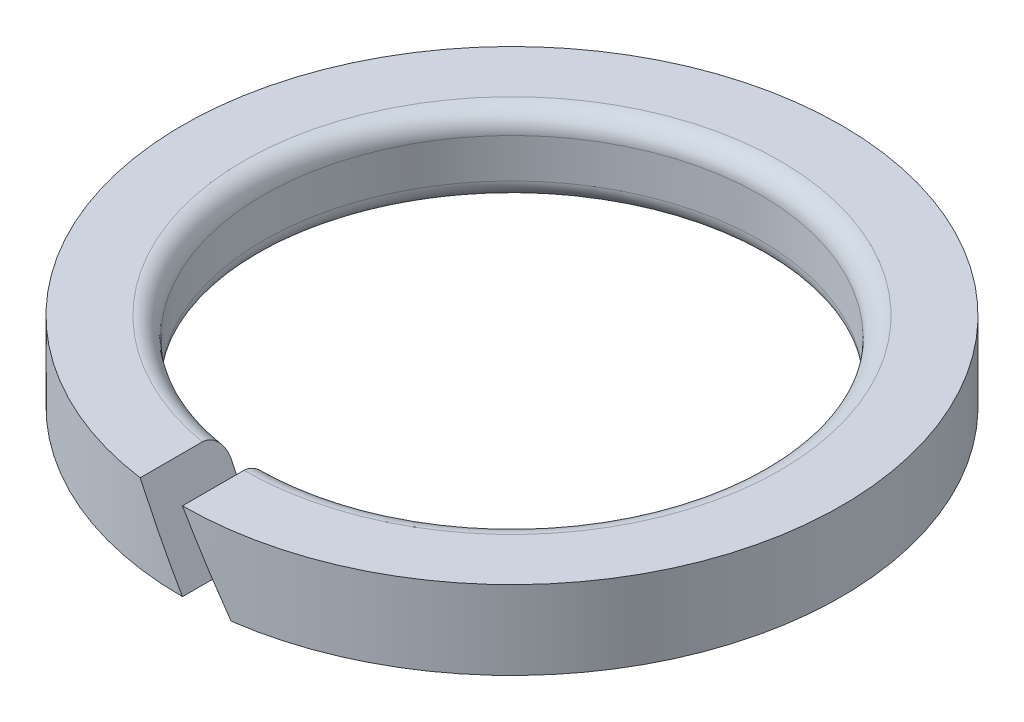
ISO-10303-21;
HEADER;
FILE_DESCRIPTION(('STEP AP214'),'2;1');
FILE_NAME('part.step','',(''),(''),'','','');
FILE_SCHEMA(('AUTOMOTIVE_DESIGN { 1 0 10303 214 1 1 1 1 }'));
ENDSEC;
DATA;
#1=APPLICATION_CONTEXT('core data for automotive mechanical design processes');
#2=APPLICATION_PROTOCOL_DEFINITION('international standard','automotive_design',2000,#1);
#3=PRODUCT_CONTEXT('',#1,'mechanical');
#4=PRODUCT('Part','Part','',(#3));
#5=PRODUCT_RELATED_PRODUCT_CATEGORY('part','',(#4));
#6=PRODUCT_DEFINITION_FORMATION('','',#4);
#7=PRODUCT_DEFINITION_CONTEXT('part definition',#1,'design');
#8=PRODUCT_DEFINITION('design','',#6,#7);
#9=PRODUCT_DEFINITION_SHAPE('','',#8);
#10=(LENGTH_UNIT() NAMED_UNIT(*) SI_UNIT(.MILLI.,.METRE.));
#11=(NAMED_UNIT(*) PLANE_ANGLE_UNIT() SI_UNIT($,.RADIAN.));
#12=(NAMED_UNIT(*) SI_UNIT($,.STERADIAN.) SOLID_ANGLE_UNIT());
#13=UNCERTAINTY_MEASURE_WITH_UNIT(LENGTH_MEASURE(1.E-05),#10,'distance_accuracy_value','');
#14=(GEOMETRIC_REPRESENTATION_CONTEXT(3) GLOBAL_UNCERTAINTY_ASSIGNED_CONTEXT((#13)) GLOBAL_UNIT_ASSIGNED_CONTEXT((#10,
#11,#12)) REPRESENTATION_CONTEXT('',''));
#15=CARTESIAN_POINT('',(0.,0.,0.));
#16=DIRECTION('',(0.,0.,1.));
#17=DIRECTION('',(1.,0.,0.));
#18=AXIS2_PLACEMENT_3D('',#15,#16,#17);
#19=CARTESIAN_POINT('',(0.,8.,0.));
#20=DIRECTION('',(0.,1.,0.));
#21=DIRECTION('',(0.,0.,1.));
#22=AXIS2_PLACEMENT_3D('',#19,#20,#21);
#23=PLANE('',#22);
#24=DIRECTION('',(0.,0.,-1.));
#25=VECTOR('',#24,1.);
#26=CARTESIAN_POINT('',(-4.61880215351698,8.,33.5));
#27=LINE('',#26,#25);
#28=CARTESIAN_POINT('',(-4.61880215351698,8.,33.1800642956982));
#29=VERTEX_POINT('',#28);
#30=CARTESIAN_POINT('',(-4.61880215351698,8.,26.855710131491));
#31=VERTEX_POINT('',#30);
#32=EDGE_CURVE('E101',#29,#31,#27,.T.);
#33=ORIENTED_EDGE('',*,*,#32,.T.);
#34=CARTESIAN_POINT('',(0.,8.,0.));
#35=DIRECTION('',(0.,1.,0.));
#36=DIRECTION('',(0.,0.,1.));
#37=AXIS2_PLACEMENT_3D('',#34,#35,#36);
#38=CIRCLE('',#37,27.25);
#39=CARTESIAN_POINT('',(0.,8.,27.25));
#40=VERTEX_POINT('',#39);
#41=EDGE_CURVE('E11',#31,#40,#38,.F.);
#42=ORIENTED_EDGE('',*,*,#41,.T.);
#43=DIRECTION('',(0.,0.,-1.));
#44=VECTOR('',#43,1.);
#45=CARTESIAN_POINT('',(0.,8.,33.5));
#46=LINE('',#45,#44);
#47=CARTESIAN_POINT('',(0.,8.,33.5));
#48=VERTEX_POINT('',#47);
#49=EDGE_CURVE('E89',#48,#40,#46,.T.);
#50=ORIENTED_EDGE('',*,*,#49,.F.);
#51=CARTESIAN_POINT('',(0.,8.,0.));
#52=DIRECTION('',(0.,1.,0.));
#53=DIRECTION('',(0.,0.,1.));
#54=AXIS2_PLACEMENT_3D('',#51,#52,#53);
#55=CIRCLE('',#54,33.5);
#56=EDGE_CURVE('E100',#48,#29,#55,.T.);
#57=ORIENTED_EDGE('',*,*,#56,.T.);
#58=EDGE_LOOP('',(#33,#42,#50,#57));
#59=FACE_BOUND('',#58,.T.);
#60=ADVANCED_FACE('F34',(#59),#23,.T.);
#61=CARTESIAN_POINT('',(0.,0.,0.));
#62=DIRECTION('',(0.,1.,0.));
#63=DIRECTION('',(0.,0.,1.));
#64=AXIS2_PLACEMENT_3D('',#61,#62,#63);
#65=PLANE('',#64);
#66=DIRECTION('',(0.,0.,-1.));
#67=VECTOR('',#66,1.);
#68=CARTESIAN_POINT('',(4.61880215351698,0.,33.5));
#69=LINE('',#68,#67);
#70=CARTESIAN_POINT('',(4.61880215351698,0.,33.1800642956982));
#71=VERTEX_POINT('',#70);
#72=CARTESIAN_POINT('',(4.61880215351698,0.,26.855710131491));
#73=VERTEX_POINT('',#72);
#74=EDGE_CURVE('E91',#71,#73,#69,.T.);
#75=ORIENTED_EDGE('',*,*,#74,.T.);
#76=CARTESIAN_POINT('',(0.,0.,0.));
#77=DIRECTION('',(0.,1.,0.));
#78=DIRECTION('',(0.,0.,1.));
#79=AXIS2_PLACEMENT_3D('',#76,#77,#78);
#80=CIRCLE('',#79,27.25);
#81=CARTESIAN_POINT('',(0.,0.,27.25));
#82=VERTEX_POINT('',#81);
#83=EDGE_CURVE('E114',#73,#82,#80,.T.);
#84=ORIENTED_EDGE('',*,*,#83,.T.);
#85=DIRECTION('',(0.,0.,-1.));
#86=VECTOR('',#85,1.);
#87=CARTESIAN_POINT('',(0.,0.,33.5));
#88=LINE('',#87,#86);
#89=CARTESIAN_POINT('',(0.,0.,33.5));
#90=VERTEX_POINT('',#89);
#91=EDGE_CURVE('E220',#90,#82,#88,.T.);
#92=ORIENTED_EDGE('',*,*,#91,.F.);
#93=CARTESIAN_POINT('',(0.,0.,0.));
#94=DIRECTION('',(0.,1.,0.));
#95=DIRECTION('',(0.,0.,1.));
#96=AXIS2_PLACEMENT_3D('',#93,#94,#95);
#97=CIRCLE('',#96,33.5);
#98=EDGE_CURVE('E96',#71,#90,#97,.T.);
#99=ORIENTED_EDGE('',*,*,#98,.F.);
#100=EDGE_LOOP('',(#75,#84,#92,#99));
#101=FACE_BOUND('',#100,.T.);
#102=ADVANCED_FACE('F156',(#101),#65,.F.);
#103=CARTESIAN_POINT('',(0.,8.,0.));
#104=DIRECTION('',(0.,-1.,0.));
#105=DIRECTION('',(0.,0.,-1.));
#106=AXIS2_PLACEMENT_3D('',#103,#104,#105);
#107=CYLINDRICAL_SURFACE('',#106,33.5);
#108=CARTESIAN_POINT('',(0.,8.,0.));
#109=DIRECTION('',(-0.86602540378444,-0.499999999999998,0.));
#110=DIRECTION('',(0.499999999999998,-0.86602540378444,0.));
#111=AXIS2_PLACEMENT_3D('',#108,#109,#110);
#112=ELLIPSE('',#111,67.0000000000003,33.5);
#113=EDGE_CURVE('E87',#71,#48,#112,.T.);
#114=ORIENTED_EDGE('',*,*,#113,.F.);
#115=ORIENTED_EDGE('',*,*,#98,.T.);
#116=CARTESIAN_POINT('',(0.,0.,0.));
#117=DIRECTION('',(0.86602540378444,0.499999999999998,0.));
#118=DIRECTION('',(0.499999999999998,-0.86602540378444,0.));
#119=AXIS2_PLACEMENT_3D('',#116,#117,#118);
#120=ELLIPSE('',#119,67.0000000000003,33.5);
#121=EDGE_CURVE('E97',#29,#90,#120,.T.);
#122=ORIENTED_EDGE('',*,*,#121,.F.);
#123=ORIENTED_EDGE('',*,*,#56,.F.);
#124=EDGE_LOOP('',(#114,#115,#122,#123));
#125=FACE_BOUND('',#124,.T.);
#126=ADVANCED_FACE('F104',(#125),#107,.T.);
#127=CARTESIAN_POINT('',(0.,8.,0.));
#128=DIRECTION('',(0.,-1.,0.));
#129=DIRECTION('',(0.,0.,-1.));
#130=AXIS2_PLACEMENT_3D('',#127,#128,#129);
#131=CYLINDRICAL_SURFACE('',#130,25.25);
#132=CARTESIAN_POINT('',(0.,0.,0.));
#133=DIRECTION('',(0.86602540378444,0.499999999999998,0.));
#134=DIRECTION('',(0.499999999999998,-0.86602540378444,0.));
#135=AXIS2_PLACEMENT_3D('',#132,#133,#134);
#136=ELLIPSE('',#135,50.5000000000002,25.25);
#137=CARTESIAN_POINT('',(-3.46410161513775,6.00000000000002,25.0112474698884));
#138=VERTEX_POINT('',#137);
#139=CARTESIAN_POINT('',(-1.15470053837925,2.00000000000001,25.2235835413342));
#140=VERTEX_POINT('',#139);
#141=EDGE_CURVE('E105',#138,#140,#136,.T.);
#142=ORIENTED_EDGE('',*,*,#141,.T.);
#143=CARTESIAN_POINT('',(0.,2.,0.));
#144=DIRECTION('',(0.,1.,0.));
#145=DIRECTION('',(0.,0.,1.));
#146=AXIS2_PLACEMENT_3D('',#143,#144,#145);
#147=CIRCLE('',#146,25.25);
#148=CARTESIAN_POINT('',(3.46410161513774,2.,25.0112474698884));
#149=VERTEX_POINT('',#148);
#150=EDGE_CURVE('E215',#140,#149,#147,.F.);
#151=ORIENTED_EDGE('',*,*,#150,.T.);
#152=CARTESIAN_POINT('',(0.,8.,0.));
#153=DIRECTION('',(-0.86602540378444,-0.499999999999998,0.));
#154=DIRECTION('',(0.499999999999998,-0.86602540378444,0.));
#155=AXIS2_PLACEMENT_3D('',#152,#153,#154);
#156=ELLIPSE('',#155,50.5000000000002,25.25);
#157=CARTESIAN_POINT('',(1.15470053837924,6.,25.2235835413342));
#158=VERTEX_POINT('',#157);
#159=EDGE_CURVE('E108',#149,#158,#156,.T.);
#160=ORIENTED_EDGE('',*,*,#159,.T.);
#161=CARTESIAN_POINT('',(0.,6.,0.));
#162=DIRECTION('',(0.,1.,0.));
#163=DIRECTION('',(0.,0.,1.));
#164=AXIS2_PLACEMENT_3D('',#161,#162,#163);
#165=CIRCLE('',#164,25.25);
#166=EDGE_CURVE('E214',#158,#138,#165,.T.);
#167=ORIENTED_EDGE('',*,*,#166,.T.);
#168=EDGE_LOOP('',(#142,#151,#160,#167));
#169=FACE_BOUND('',#168,.T.);
#170=ADVANCED_FACE('F132',(#169),#131,.F.);
#171=CARTESIAN_POINT('',(0.,0.,33.5));
#172=DIRECTION('',(0.86602540378444,0.499999999999998,0.));
#173=DIRECTION('',(-0.499999999999998,0.86602540378444,0.));
#174=AXIS2_PLACEMENT_3D('',#171,#172,#173);
#175=PLANE('',#174);
#176=ORIENTED_EDGE('',*,*,#91,.T.);
#177=CARTESIAN_POINT('',(0.,0.,27.25));
#178=CARTESIAN_POINT('',(5.10975107489599E-06,-8.85034847575498E-06,27.1990278515768));
#179=CARTESIAN_POINT('',(-0.0011248915475984,0.00194836931344521,27.1480607499647));
#180=CARTESIAN_POINT('',(-0.00561609105124405,0.00972735504068765,27.0465383086451));
#181=CARTESIAN_POINT('',(-0.00897652359712368,0.0155477949455592,26.9959828336614));
#182=CARTESIAN_POINT('',(-0.0178697271162579,0.0309512752827502,26.8958736236166));
#183=CARTESIAN_POINT('',(-0.0233927394789516,0.0405174133057667,26.8463164256403));
#184=CARTESIAN_POINT('',(-0.0365335692625409,0.0632779981445579,26.7483380784702));
#185=CARTESIAN_POINT('',(-0.0441514801956002,0.076472606928151,26.6999169800943));
#186=CARTESIAN_POINT('',(-0.0699989756506826,0.12124178230476,26.5569489292629));
#187=CARTESIAN_POINT('',(-0.0912393205477315,0.158031138836735,26.4645103144444));
#188=CARTESIAN_POINT('',(-0.140780337139241,0.243838696631842,26.2875643864683));
#189=CARTESIAN_POINT('',(-0.169087281258799,0.29286776205393,26.2030642117981));
#190=CARTESIAN_POINT('',(-0.233398147142047,0.404257449242464,26.0390508481762));
#191=CARTESIAN_POINT('',(-0.269740570043424,0.467204372177804,25.9600700417508));
#192=CARTESIAN_POINT('',(-0.347790715244217,0.602391189203707,25.8136143967677));
#193=CARTESIAN_POINT('',(-0.389499843813009,0.674633519024277,25.746142584795));
#194=CARTESIAN_POINT('',(-0.483302733642174,0.837104890105178,25.614551340226));
#195=CARTESIAN_POINT('',(-0.536031596844248,0.928433960196519,25.5522445692154));
#196=CARTESIAN_POINT('',(-0.645480509534529,1.11800503780926,25.4435688374276));
#197=CARTESIAN_POINT('',(-0.702205015874863,1.21625476482498,25.3972180246604));
#198=CARTESIAN_POINT('',(-0.823899864766214,1.42703642612422,25.3169212451128));
#199=CARTESIAN_POINT('',(-0.889138053118776,1.5400322829446,25.2846011611113));
#200=CARTESIAN_POINT('',(-1.02112812972964,1.76864580172952,25.239492732433));
#201=CARTESIAN_POINT('',(-1.08787610811094,1.88425669158845,25.2266587475356));
#202=CARTESIAN_POINT('',(-1.15470053837925,2.,25.2235835413342));
#203=B_SPLINE_CURVE_WITH_KNOTS('',3,(#177,#178,#179,#180,#181,#182,#183,#184,#185,#186,#187,
#188,#189,#190,#191,#192,#193,#194,#195,#196,#197,#198,#199,#200,#201,#202),.UNSPECIFIED.,.F.,
.F.,(4,2,2,2,2,2,2,2,2,2,2,2,4),(0.,0.152857924182382,0.305663402645712,0.45778715103197,
0.609917691026567,0.913616132487173,1.21758510595596,1.53832521378747,1.85914953884514,
2.22518957542007,2.59164457412787,2.99341414680034,3.39424123769922),.UNSPECIFIED.);
#204=EDGE_CURVE('E123',#82,#140,#203,.T.);
#205=ORIENTED_EDGE('',*,*,#204,.T.);
#206=ORIENTED_EDGE('',*,*,#141,.F.);
#207=CARTESIAN_POINT('',(-3.46410161513774,6.,25.0112474698884));
#208=CARTESIAN_POINT('',(-3.53490844278672,6.12264102301081,25.0014393766555));
#209=CARTESIAN_POINT('',(-3.60623476906791,6.24618184404706,25.0026556912724));
#210=CARTESIAN_POINT('',(-3.74850254477895,6.49259685985841,25.0284645204244));
#211=CARTESIAN_POINT('',(-3.81943347418945,6.61545283342548,25.0532846664184));
#212=CARTESIAN_POINT('',(-3.95833914013497,6.85604450430231,25.1280387586674));
#213=CARTESIAN_POINT('',(-4.02629895575517,6.97375435782951,25.1780864712413));
#214=CARTESIAN_POINT('',(-4.15571825710508,7.19791516324761,25.3040062488735));
#215=CARTESIAN_POINT('',(-4.21720661785712,7.30441612814428,25.3797566199833));
#216=CARTESIAN_POINT('',(-4.31413455712676,7.47230024363224,25.5308987347501));
#217=CARTESIAN_POINT('',(-4.35198422110399,7.53785778469022,25.6001484207776));
#218=CARTESIAN_POINT('',(-4.42139352362151,7.65807822316847,25.7503553903848));
#219=CARTESIAN_POINT('',(-4.45295478562935,7.71274393251706,25.831309642876));
#220=CARTESIAN_POINT('',(-4.5086093604611,7.80914048379929,26.0033233219123));
#221=CARTESIAN_POINT('',(-4.532676932734,7.85082674179078,26.0944161511588));
#222=CARTESIAN_POINT('',(-4.5722383101104,7.91934905742411,26.2837898350116));
#223=CARTESIAN_POINT('',(-4.58773499039055,7.94619009501799,26.3820682666072));
#224=CARTESIAN_POINT('',(-4.60543712481747,7.97685109124783,26.5435823161272));
#225=CARTESIAN_POINT('',(-4.61046595927021,7.98556128802282,26.6056413927392));
#226=CARTESIAN_POINT('',(-4.61714861938157,7.99713599486542,26.7303652472421));
#227=CARTESIAN_POINT('',(-4.61880882402983,8.00001155366716,26.7930286541211));
#228=CARTESIAN_POINT('',(-4.61880215351698,8.,26.855710131491));
#229=B_SPLINE_CURVE_WITH_KNOTS('',3,(#207,#208,#209,#210,#211,#212,#213,#214,#215,#216,#217,
#218,#219,#220,#221,#222,#223,#224,#225,#226,#227,#228),.UNSPECIFIED.,.F.,.F.,(4,2,2,2,2,2,2,2,
2,2,4),(0.,0.425865616400393,0.855880306606806,1.28785177732677,1.71780589631261,
2.02430834313816,2.3307315578501,2.63819600026513,2.94555723853329,3.13382712801995,
3.32174016715302),.UNSPECIFIED.);
#230=EDGE_CURVE('E117',#138,#31,#229,.T.);
#231=ORIENTED_EDGE('',*,*,#230,.T.);
#232=ORIENTED_EDGE('',*,*,#32,.F.);
#233=ORIENTED_EDGE('',*,*,#121,.T.);
#234=EDGE_LOOP('',(#176,#205,#206,#231,#232,#233));
#235=FACE_BOUND('',#234,.T.);
#236=ADVANCED_FACE('F128',(#235),#175,.T.);
#237=CARTESIAN_POINT('',(0.,8.,33.5));
#238=DIRECTION('',(-0.86602540378444,-0.499999999999998,0.));
#239=DIRECTION('',(0.499999999999998,-0.86602540378444,0.));
#240=AXIS2_PLACEMENT_3D('',#237,#238,#239);
#241=PLANE('',#240);
#242=ORIENTED_EDGE('',*,*,#159,.F.);
#243=CARTESIAN_POINT('',(3.46410161513774,2.,25.0112474698884));
#244=CARTESIAN_POINT('',(3.53490844278672,1.87735897698919,25.0014393766555));
#245=CARTESIAN_POINT('',(3.60623476906791,1.75381815595294,25.0026556912724));
#246=CARTESIAN_POINT('',(3.74850254477895,1.50740314014159,25.0284645204244));
#247=CARTESIAN_POINT('',(3.81943347418945,1.38454716657453,25.0532846664184));
#248=CARTESIAN_POINT('',(3.95833914013497,1.14395549569769,25.1280387586674));
#249=CARTESIAN_POINT('',(4.02629895575517,1.02624564217049,25.1780864712413));
#250=CARTESIAN_POINT('',(4.15571825710508,0.802084836752388,25.3040062488735));
#251=CARTESIAN_POINT('',(4.21720661785712,0.695583871855722,25.3797566199833));
#252=CARTESIAN_POINT('',(4.31413455712676,0.527699756367756,25.5308987347501));
#253=CARTESIAN_POINT('',(4.35198422110399,0.462142215309785,25.6001484207776));
#254=CARTESIAN_POINT('',(4.4213935236215,0.34192177683153,25.7503553903848));
#255=CARTESIAN_POINT('',(4.45295478562935,0.287256067482944,25.831309642876));
#256=CARTESIAN_POINT('',(4.5086093604611,0.190859516200705,26.0033233219123));
#257=CARTESIAN_POINT('',(4.532676932734,0.14917325820922,26.0944161511588));
#258=CARTESIAN_POINT('',(4.5722383101104,0.0806509425758891,26.2837898350116));
#259=CARTESIAN_POINT('',(4.58773499039055,0.0538099049820131,26.3820682666072));
#260=CARTESIAN_POINT('',(4.60543712481747,0.0231489087521738,26.5435823161272));
#261=CARTESIAN_POINT('',(4.61046595927021,0.0144387119771773,26.6056413927392));
#262=CARTESIAN_POINT('',(4.61714861938157,0.00286400513458443,26.7303652472421));
#263=CARTESIAN_POINT('',(4.61880882402983,-1.15536671598054E-05,26.7930286541211));
#264=CARTESIAN_POINT('',(4.61880215351698,0.,26.855710131491));
#265=B_SPLINE_CURVE_WITH_KNOTS('',3,(#243,#244,#245,#246,#247,#248,#249,#250,#251,#252,#253,
#254,#255,#256,#257,#258,#259,#260,#261,#262,#263,#264),.UNSPECIFIED.,.F.,.F.,(4,2,2,2,2,2,2,2,
2,2,4),(0.,0.425865616400393,0.855880306606807,1.28785177732677,1.71780589631261,
2.02430834313816,2.3307315578501,2.63819600026514,2.9455572385333,3.13382712801995,
3.32174016715302),.UNSPECIFIED.);
#266=EDGE_CURVE('E43',#149,#73,#265,.T.);
#267=ORIENTED_EDGE('',*,*,#266,.T.);
#268=ORIENTED_EDGE('',*,*,#74,.F.);
#269=ORIENTED_EDGE('',*,*,#113,.T.);
#270=ORIENTED_EDGE('',*,*,#49,.T.);
#271=CARTESIAN_POINT('',(0.,8.,27.25));
#272=CARTESIAN_POINT('',(-5.10975107498438E-06,8.00000885034848,27.1990278515768));
#273=CARTESIAN_POINT('',(0.00112489154759835,7.99805163068655,27.1480607499647));
#274=CARTESIAN_POINT('',(0.00561609105124407,7.99027264495931,27.0465383086451));
#275=CARTESIAN_POINT('',(0.00897652359712368,7.98445220505444,26.9959828336614));
#276=CARTESIAN_POINT('',(0.0178697271162577,7.96904872471725,26.8958736236166));
#277=CARTESIAN_POINT('',(0.0233927394789512,7.95948258669423,26.8463164256403));
#278=CARTESIAN_POINT('',(0.0365335692625405,7.93672200185544,26.7483380784702));
#279=CARTESIAN_POINT('',(0.0441514801956,7.92352739307185,26.6999169800943));
#280=CARTESIAN_POINT('',(0.0699989756506827,7.87875821769524,26.5569489292629));
#281=CARTESIAN_POINT('',(0.0912393205477316,7.84196886116327,26.4645103144444));
#282=CARTESIAN_POINT('',(0.14078033713924,7.75616130336816,26.2875643864683));
#283=CARTESIAN_POINT('',(0.169087281258799,7.70713223794607,26.2030642117981));
#284=CARTESIAN_POINT('',(0.233398147142047,7.59574255075754,26.0390508481762));
#285=CARTESIAN_POINT('',(0.269740570043424,7.5327956278222,25.9600700417508));
#286=CARTESIAN_POINT('',(0.347790715244217,7.39760881079629,25.8136143967677));
#287=CARTESIAN_POINT('',(0.389499843813008,7.32536648097572,25.746142584795));
#288=CARTESIAN_POINT('',(0.483302733642174,7.16289510989482,25.614551340226));
#289=CARTESIAN_POINT('',(0.536031596844248,7.07156603980348,25.5522445692154));
#290=CARTESIAN_POINT('',(0.645480509534529,6.88199496219074,25.4435688374276));
#291=CARTESIAN_POINT('',(0.702205015874863,6.78374523517502,25.3972180246604));
#292=CARTESIAN_POINT('',(0.823899864766214,6.57296357387578,25.3169212451128));
#293=CARTESIAN_POINT('',(0.889138053118776,6.4599677170554,25.2846011611113));
#294=CARTESIAN_POINT('',(1.02112812972964,6.23135419827048,25.239492732433));
#295=CARTESIAN_POINT('',(1.08787610811094,6.11574330841155,25.2266587475356));
#296=CARTESIAN_POINT('',(1.15470053837925,6.,25.2235835413342));
#297=B_SPLINE_CURVE_WITH_KNOTS('',3,(#271,#272,#273,#274,#275,#276,#277,#278,#279,#280,#281,
#282,#283,#284,#285,#286,#287,#288,#289,#290,#291,#292,#293,#294,#295,#296),.UNSPECIFIED.,.F.,
.F.,(4,2,2,2,2,2,2,2,2,2,2,2,4),(0.,0.152857924182382,0.305663402645709,0.457787151031966,
0.609917691026567,0.913616132487173,1.21758510595596,1.53832521378747,1.85914953884514,
2.22518957542007,2.59164457412787,2.99341414680034,3.39424123769922),.UNSPECIFIED.);
#298=EDGE_CURVE('E55',#40,#158,#297,.T.);
#299=ORIENTED_EDGE('',*,*,#298,.T.);
#300=EDGE_LOOP('',(#242,#267,#268,#269,#270,#299));
#301=FACE_BOUND('',#300,.T.);
#302=ADVANCED_FACE('F88',(#301),#241,.T.);
#303=CARTESIAN_POINT('',(0.,2.,0.));
#304=DIRECTION('',(0.,1.,0.));
#305=DIRECTION('',(0.,0.,1.));
#306=AXIS2_PLACEMENT_3D('',#303,#304,#305);
#307=TOROIDAL_SURFACE('',#306,27.25,2.);
#308=ORIENTED_EDGE('',*,*,#266,.F.);
#309=ORIENTED_EDGE('',*,*,#150,.F.);
#310=ORIENTED_EDGE('',*,*,#204,.F.);
#311=ORIENTED_EDGE('',*,*,#83,.F.);
#312=EDGE_LOOP('',(#308,#309,#310,#311));
#313=FACE_BOUND('',#312,.T.);
#314=ADVANCED_FACE('F138',(#313),#307,.T.);
#315=CARTESIAN_POINT('',(0.,6.,0.));
#316=DIRECTION('',(0.,1.,0.));
#317=DIRECTION('',(0.,0.,1.));
#318=AXIS2_PLACEMENT_3D('',#315,#316,#317);
#319=TOROIDAL_SURFACE('',#318,27.25,2.);
#320=ORIENTED_EDGE('',*,*,#298,.F.);
#321=ORIENTED_EDGE('',*,*,#41,.F.);
#322=ORIENTED_EDGE('',*,*,#230,.F.);
#323=ORIENTED_EDGE('',*,*,#166,.F.);
#324=EDGE_LOOP('',(#320,#321,#322,#323));
#325=FACE_BOUND('',#324,.T.);
#326=ADVANCED_FACE('F36',(#325),#319,.T.);
#327=CLOSED_SHELL('',(#60,#102,#126,#170,#236,#302,#314,#326));
#328=MANIFOLD_SOLID_BREP('B2',#327);
#329=ADVANCED_BREP_SHAPE_REPRESENTATION('',(#18,#328),#14);
#330=SHAPE_DEFINITION_REPRESENTATION(#9,#329);
ENDSEC;
END-ISO-10303-21;
